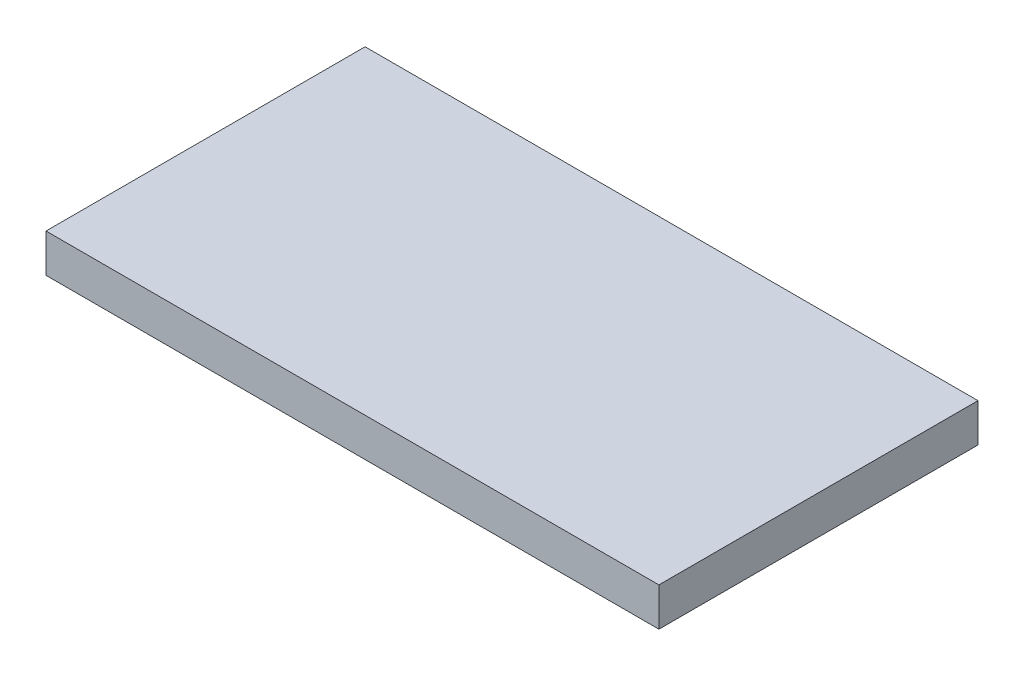
ISO-10303-21;
HEADER;
FILE_DESCRIPTION(('STEP AP214'),'2;1');
FILE_NAME('part.step','',(''),(''),'','','');
FILE_SCHEMA(('AUTOMOTIVE_DESIGN { 1 0 10303 214 1 1 1 1 }'));
ENDSEC;
DATA;
#1=APPLICATION_CONTEXT('core data for automotive mechanical design processes');
#2=APPLICATION_PROTOCOL_DEFINITION('international standard','automotive_design',2000,#1);
#3=PRODUCT_CONTEXT('',#1,'mechanical');
#4=PRODUCT('Part','Part','',(#3));
#5=PRODUCT_RELATED_PRODUCT_CATEGORY('part','',(#4));
#6=PRODUCT_DEFINITION_FORMATION('','',#4);
#7=PRODUCT_DEFINITION_CONTEXT('part definition',#1,'design');
#8=PRODUCT_DEFINITION('design','',#6,#7);
#9=PRODUCT_DEFINITION_SHAPE('','',#8);
#10=(LENGTH_UNIT() NAMED_UNIT(*) SI_UNIT(.MILLI.,.METRE.));
#11=(NAMED_UNIT(*) PLANE_ANGLE_UNIT() SI_UNIT($,.RADIAN.));
#12=(NAMED_UNIT(*) SI_UNIT($,.STERADIAN.) SOLID_ANGLE_UNIT());
#13=UNCERTAINTY_MEASURE_WITH_UNIT(LENGTH_MEASURE(1.E-05),#10,'distance_accuracy_value','');
#14=(GEOMETRIC_REPRESENTATION_CONTEXT(3) GLOBAL_UNCERTAINTY_ASSIGNED_CONTEXT((#13)) GLOBAL_UNIT_ASSIGNED_CONTEXT((#10,
#11,#12)) REPRESENTATION_CONTEXT('',''));
#15=CARTESIAN_POINT('',(0.,0.,0.));
#16=DIRECTION('',(0.,0.,1.));
#17=DIRECTION('',(1.,0.,0.));
#18=AXIS2_PLACEMENT_3D('',#15,#16,#17);
#19=CARTESIAN_POINT('',(-60.2033127592154,19.05,21.010039351249));
#20=DIRECTION('',(1.,0.,0.));
#21=DIRECTION('',(0.,0.,-1.));
#22=AXIS2_PLACEMENT_3D('',#19,#20,#21);
#23=PLANE('',#22);
#24=DIRECTION('',(0.,0.,1.));
#25=VECTOR('',#24,1.);
#26=CARTESIAN_POINT('',(-60.2033127592154,0.,21.010039351249));
#27=LINE('',#26,#25);
#28=CARTESIAN_POINT('',(-60.2033127592154,0.,-137.257360648754));
#29=VERTEX_POINT('',#28);
#30=CARTESIAN_POINT('',(-60.2033127592154,0.,21.010039351249));
#31=VERTEX_POINT('',#30);
#32=EDGE_CURVE('E102',#29,#31,#27,.T.);
#33=ORIENTED_EDGE('',*,*,#32,.T.);
#34=DIRECTION('',(0.,-1.,0.));
#35=VECTOR('',#34,1.);
#36=CARTESIAN_POINT('',(-60.2033127592154,19.05,21.010039351249));
#37=LINE('',#36,#35);
#38=CARTESIAN_POINT('',(-60.2033127592154,19.05,21.010039351249));
#39=VERTEX_POINT('',#38);
#40=EDGE_CURVE('E11',#39,#31,#37,.T.);
#41=ORIENTED_EDGE('',*,*,#40,.F.);
#42=DIRECTION('',(0.,0.,1.));
#43=VECTOR('',#42,1.);
#44=CARTESIAN_POINT('',(-60.2033127592154,19.05,21.010039351249));
#45=LINE('',#44,#43);
#46=CARTESIAN_POINT('',(-60.2033127592154,19.05,-137.257360648754));
#47=VERTEX_POINT('',#46);
#48=EDGE_CURVE('E90',#47,#39,#45,.T.);
#49=ORIENTED_EDGE('',*,*,#48,.F.);
#50=DIRECTION('',(0.,-1.,0.));
#51=VECTOR('',#50,1.);
#52=CARTESIAN_POINT('',(-60.2033127592154,19.05,-137.257360648754));
#53=LINE('',#52,#51);
#54=EDGE_CURVE('E98',#47,#29,#53,.T.);
#55=ORIENTED_EDGE('',*,*,#54,.T.);
#56=EDGE_LOOP('',(#33,#41,#49,#55));
#57=FACE_BOUND('',#56,.T.);
#58=ADVANCED_FACE('F39',(#57),#23,.F.);
#59=CARTESIAN_POINT('',(-60.2033127592154,19.05,21.010039351249));
#60=DIRECTION('',(0.,0.,-1.));
#61=DIRECTION('',(-1.,0.,0.));
#62=AXIS2_PLACEMENT_3D('',#59,#60,#61);
#63=PLANE('',#62);
#64=DIRECTION('',(1.,0.,0.));
#65=VECTOR('',#64,1.);
#66=CARTESIAN_POINT('',(-60.2033127592154,0.,21.010039351249));
#67=LINE('',#66,#65);
#68=CARTESIAN_POINT('',(243.801587240779,0.,21.010039351249));
#69=VERTEX_POINT('',#68);
#70=EDGE_CURVE('E94',#31,#69,#67,.T.);
#71=ORIENTED_EDGE('',*,*,#70,.T.);
#72=DIRECTION('',(0.,-1.,0.));
#73=VECTOR('',#72,1.);
#74=CARTESIAN_POINT('',(243.801587240779,19.05,21.010039351249));
#75=LINE('',#74,#73);
#76=CARTESIAN_POINT('',(243.801587240779,19.05,21.010039351249));
#77=VERTEX_POINT('',#76);
#78=EDGE_CURVE('E47',#77,#69,#75,.T.);
#79=ORIENTED_EDGE('',*,*,#78,.F.);
#80=DIRECTION('',(1.,0.,0.));
#81=VECTOR('',#80,1.);
#82=CARTESIAN_POINT('',(-60.2033127592154,19.05,21.010039351249));
#83=LINE('',#82,#81);
#84=EDGE_CURVE('E85',#39,#77,#83,.T.);
#85=ORIENTED_EDGE('',*,*,#84,.F.);
#86=ORIENTED_EDGE('',*,*,#40,.T.);
#87=EDGE_LOOP('',(#71,#79,#85,#86));
#88=FACE_BOUND('',#87,.T.);
#89=ADVANCED_FACE('F93',(#88),#63,.F.);
#90=CARTESIAN_POINT('',(243.801587240779,19.05,21.010039351249));
#91=DIRECTION('',(-1.,0.,0.));
#92=DIRECTION('',(0.,0.,1.));
#93=AXIS2_PLACEMENT_3D('',#90,#91,#92);
#94=PLANE('',#93);
#95=DIRECTION('',(0.,0.,-1.));
#96=VECTOR('',#95,1.);
#97=CARTESIAN_POINT('',(243.801587240779,0.,21.010039351249));
#98=LINE('',#97,#96);
#99=CARTESIAN_POINT('',(243.801587240779,0.,-137.257360648754));
#100=VERTEX_POINT('',#99);
#101=EDGE_CURVE('E72',#69,#100,#98,.T.);
#102=ORIENTED_EDGE('',*,*,#101,.T.);
#103=DIRECTION('',(0.,-1.,0.));
#104=VECTOR('',#103,1.);
#105=CARTESIAN_POINT('',(243.801587240779,19.05,-137.257360648754));
#106=LINE('',#105,#104);
#107=CARTESIAN_POINT('',(243.801587240779,19.05,-137.257360648754));
#108=VERTEX_POINT('',#107);
#109=EDGE_CURVE('E95',#108,#100,#106,.T.);
#110=ORIENTED_EDGE('',*,*,#109,.F.);
#111=DIRECTION('',(0.,0.,-1.));
#112=VECTOR('',#111,1.);
#113=CARTESIAN_POINT('',(243.801587240779,19.05,21.010039351249));
#114=LINE('',#113,#112);
#115=EDGE_CURVE('E88',#77,#108,#114,.T.);
#116=ORIENTED_EDGE('',*,*,#115,.F.);
#117=ORIENTED_EDGE('',*,*,#78,.T.);
#118=EDGE_LOOP('',(#102,#110,#116,#117));
#119=FACE_BOUND('',#118,.T.);
#120=ADVANCED_FACE('F96',(#119),#94,.F.);
#121=CARTESIAN_POINT('',(-60.2033127592154,19.05,-137.257360648754));
#122=DIRECTION('',(0.,0.,1.));
#123=DIRECTION('',(1.,0.,0.));
#124=AXIS2_PLACEMENT_3D('',#121,#122,#123);
#125=PLANE('',#124);
#126=DIRECTION('',(-1.,0.,0.));
#127=VECTOR('',#126,1.);
#128=CARTESIAN_POINT('',(-60.2033127592154,0.,-137.257360648754));
#129=LINE('',#128,#127);
#130=EDGE_CURVE('E78',#100,#29,#129,.T.);
#131=ORIENTED_EDGE('',*,*,#130,.T.);
#132=ORIENTED_EDGE('',*,*,#54,.F.);
#133=DIRECTION('',(-1.,0.,0.));
#134=VECTOR('',#133,1.);
#135=CARTESIAN_POINT('',(-60.2033127592154,19.05,-137.257360648754));
#136=LINE('',#135,#134);
#137=EDGE_CURVE('E55',#108,#47,#136,.T.);
#138=ORIENTED_EDGE('',*,*,#137,.F.);
#139=ORIENTED_EDGE('',*,*,#109,.T.);
#140=EDGE_LOOP('',(#131,#132,#138,#139));
#141=FACE_BOUND('',#140,.T.);
#142=ADVANCED_FACE('F109',(#141),#125,.F.);
#143=CARTESIAN_POINT('',(0.,19.05,0.));
#144=DIRECTION('',(0.,-1.,0.));
#145=DIRECTION('',(0.,0.,-1.));
#146=AXIS2_PLACEMENT_3D('',#143,#144,#145);
#147=PLANE('',#146);
#148=ORIENTED_EDGE('',*,*,#48,.T.);
#149=ORIENTED_EDGE('',*,*,#84,.T.);
#150=ORIENTED_EDGE('',*,*,#115,.T.);
#151=ORIENTED_EDGE('',*,*,#137,.T.);
#152=EDGE_LOOP('',(#148,#149,#150,#151));
#153=FACE_BOUND('',#152,.T.);
#154=ADVANCED_FACE('F86',(#153),#147,.F.);
#155=CARTESIAN_POINT('',(0.,0.,0.));
#156=DIRECTION('',(0.,-1.,0.));
#157=DIRECTION('',(0.,0.,-1.));
#158=AXIS2_PLACEMENT_3D('',#155,#156,#157);
#159=PLANE('',#158);
#160=ORIENTED_EDGE('',*,*,#32,.F.);
#161=ORIENTED_EDGE('',*,*,#130,.F.);
#162=ORIENTED_EDGE('',*,*,#101,.F.);
#163=ORIENTED_EDGE('',*,*,#70,.F.);
#164=EDGE_LOOP('',(#160,#161,#162,#163));
#165=FACE_BOUND('',#164,.T.);
#166=ADVANCED_FACE('F112',(#165),#159,.T.);
#167=CLOSED_SHELL('',(#58,#89,#120,#142,#154,#166));
#168=MANIFOLD_SOLID_BREP('B2',#167);
#169=ADVANCED_BREP_SHAPE_REPRESENTATION('',(#18,#168),#14);
#170=SHAPE_DEFINITION_REPRESENTATION(#9,#169);
ENDSEC;
END-ISO-10303-21;
